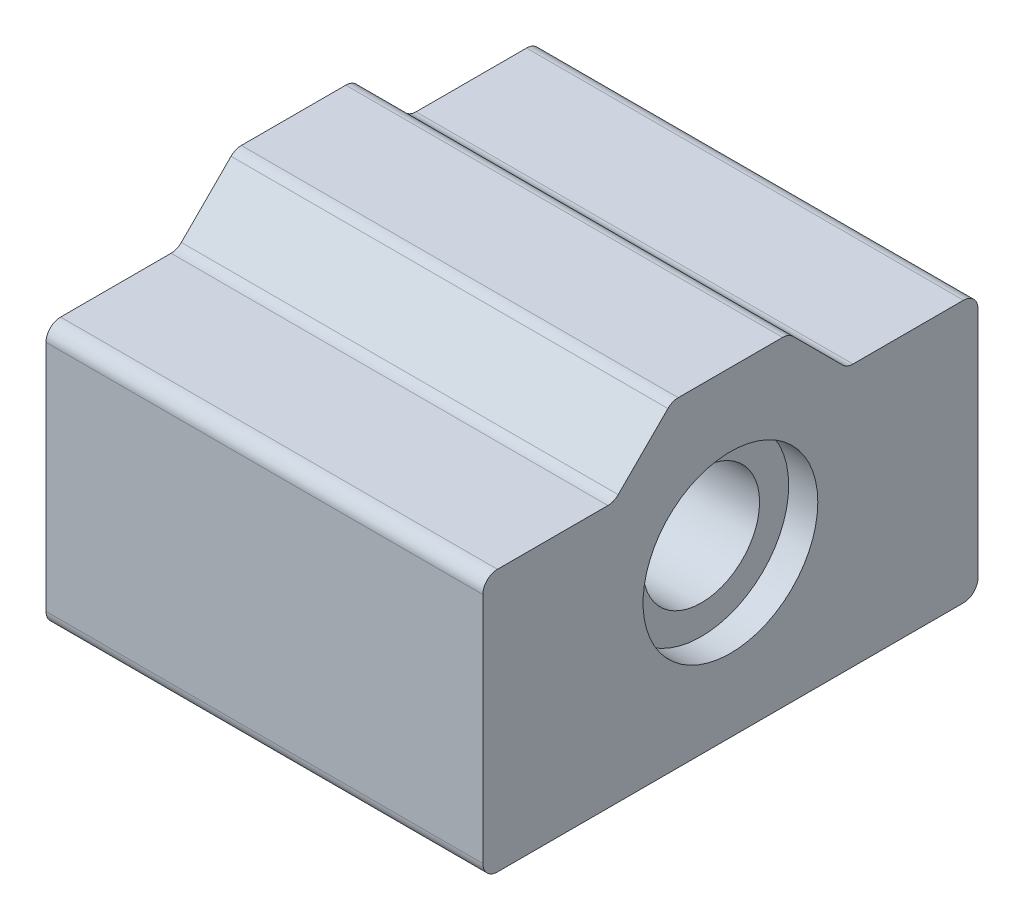
ISO-10303-21;
HEADER;
FILE_DESCRIPTION(('STEP AP214'),'2;1');
FILE_NAME('part.step','',(''),(''),'','','');
FILE_SCHEMA(('AUTOMOTIVE_DESIGN { 1 0 10303 214 1 1 1 1 }'));
ENDSEC;
DATA;
#1=APPLICATION_CONTEXT('core data for automotive mechanical design processes');
#2=APPLICATION_PROTOCOL_DEFINITION('international standard','automotive_design',2000,#1);
#3=PRODUCT_CONTEXT('',#1,'mechanical');
#4=PRODUCT('Part','Part','',(#3));
#5=PRODUCT_RELATED_PRODUCT_CATEGORY('part','',(#4));
#6=PRODUCT_DEFINITION_FORMATION('','',#4);
#7=PRODUCT_DEFINITION_CONTEXT('part definition',#1,'design');
#8=PRODUCT_DEFINITION('design','',#6,#7);
#9=PRODUCT_DEFINITION_SHAPE('','',#8);
#10=(LENGTH_UNIT() NAMED_UNIT(*) SI_UNIT(.MILLI.,.METRE.));
#11=(NAMED_UNIT(*) PLANE_ANGLE_UNIT() SI_UNIT($,.RADIAN.));
#12=(NAMED_UNIT(*) SI_UNIT($,.STERADIAN.) SOLID_ANGLE_UNIT());
#13=UNCERTAINTY_MEASURE_WITH_UNIT(LENGTH_MEASURE(1.E-05),#10,'distance_accuracy_value','');
#14=(GEOMETRIC_REPRESENTATION_CONTEXT(3) GLOBAL_UNCERTAINTY_ASSIGNED_CONTEXT((#13)) GLOBAL_UNIT_ASSIGNED_CONTEXT((#10,
#11,#12)) REPRESENTATION_CONTEXT('',''));
#15=CARTESIAN_POINT('',(0.,0.,0.));
#16=DIRECTION('',(0.,0.,1.));
#17=DIRECTION('',(1.,0.,0.));
#18=AXIS2_PLACEMENT_3D('',#15,#16,#17);
#19=CARTESIAN_POINT('',(30.,-7.,-4.88281199959495));
#20=DIRECTION('',(-1.,0.,0.));
#21=DIRECTION('',(0.,0.,1.));
#22=AXIS2_PLACEMENT_3D('',#19,#20,#21);
#23=CYLINDRICAL_SURFACE('',#22,4.);
#24=CARTESIAN_POINT('',(2.,-7.,-4.88281199959495));
#25=DIRECTION('',(-1.,0.,0.));
#26=DIRECTION('',(0.,0.,1.));
#27=AXIS2_PLACEMENT_3D('',#24,#25,#26);
#28=CIRCLE('',#27,4.);
#29=CARTESIAN_POINT('',(2.,-7.,-0.882811999594952));
#30=VERTEX_POINT('',#29);
#31=EDGE_CURVE('E247',#30,#30,#28,.T.);
#32=ORIENTED_EDGE('',*,*,#31,.T.);
#33=EDGE_LOOP('',(#32));
#34=FACE_BOUND('',#33,.T.);
#35=CARTESIAN_POINT('',(28.,-7.,-4.88281199959495));
#36=DIRECTION('',(1.,0.,0.));
#37=DIRECTION('',(0.,0.,-1.));
#38=AXIS2_PLACEMENT_3D('',#35,#36,#37);
#39=CIRCLE('',#38,4.);
#40=CARTESIAN_POINT('',(28.,-7.,-8.88281199959495));
#41=VERTEX_POINT('',#40);
#42=EDGE_CURVE('E38',#41,#41,#39,.T.);
#43=ORIENTED_EDGE('',*,*,#42,.T.);
#44=EDGE_LOOP('',(#43));
#45=FACE_BOUND('',#44,.T.);
#46=ADVANCED_FACE('F34',(#34,#45),#23,.F.);
#47=CARTESIAN_POINT('',(30.,-17.,11.117188000405));
#48=DIRECTION('',(-1.,0.,0.));
#49=DIRECTION('',(0.,0.,1.));
#50=AXIS2_PLACEMENT_3D('',#47,#48,#49);
#51=PLANE('',#50);
#52=CARTESIAN_POINT('',(30.,-7.,-4.88281199959495));
#53=DIRECTION('',(1.,0.,0.));
#54=DIRECTION('',(0.,0.,-1.));
#55=AXIS2_PLACEMENT_3D('',#52,#53,#54);
#56=CIRCLE('',#55,6.);
#57=CARTESIAN_POINT('',(30.,-7.,-10.882811999595));
#58=VERTEX_POINT('',#57);
#59=EDGE_CURVE('E264',#58,#58,#56,.T.);
#60=ORIENTED_EDGE('',*,*,#59,.F.);
#61=EDGE_LOOP('',(#60));
#62=FACE_BOUND('',#61,.T.);
#63=CARTESIAN_POINT('',(30.,-17.,11.117188000405));
#64=DIRECTION('',(1.,0.,0.));
#65=DIRECTION('',(0.,0.,1.));
#66=AXIS2_PLACEMENT_3D('',#63,#64,#65);
#67=CIRCLE('',#66,1.);
#68=CARTESIAN_POINT('',(30.,-17.,12.117188000405));
#69=VERTEX_POINT('',#68);
#70=CARTESIAN_POINT('',(30.,-18.,11.117188000405));
#71=VERTEX_POINT('',#70);
#72=EDGE_CURVE('E212',#69,#71,#67,.T.);
#73=ORIENTED_EDGE('',*,*,#72,.T.);
#74=DIRECTION('',(0.,0.,-1.));
#75=VECTOR('',#74,1.);
#76=CARTESIAN_POINT('',(30.,-18.,11.117188000405));
#77=LINE('',#76,#75);
#78=CARTESIAN_POINT('',(30.,-18.,-20.8828119995949));
#79=VERTEX_POINT('',#78);
#80=EDGE_CURVE('E120',#71,#79,#77,.T.);
#81=ORIENTED_EDGE('',*,*,#80,.T.);
#82=CARTESIAN_POINT('',(30.,-17.,-20.882811999595));
#83=DIRECTION('',(1.,0.,0.));
#84=DIRECTION('',(0.,0.,1.));
#85=AXIS2_PLACEMENT_3D('',#82,#83,#84);
#86=CIRCLE('',#85,1.);
#87=CARTESIAN_POINT('',(30.,-17.,-21.882811999595));
#88=VERTEX_POINT('',#87);
#89=EDGE_CURVE('E288',#79,#88,#86,.T.);
#90=ORIENTED_EDGE('',*,*,#89,.T.);
#91=DIRECTION('',(0.,1.,0.));
#92=VECTOR('',#91,1.);
#93=CARTESIAN_POINT('',(30.,-17.,-21.882811999595));
#94=LINE('',#93,#92);
#95=CARTESIAN_POINT('',(30.,-1.00000000000001,-21.8828119995949));
#96=VERTEX_POINT('',#95);
#97=EDGE_CURVE('E290',#88,#96,#94,.T.);
#98=ORIENTED_EDGE('',*,*,#97,.T.);
#99=CARTESIAN_POINT('',(30.,-1.,-20.8828119995949));
#100=DIRECTION('',(1.,0.,0.));
#101=DIRECTION('',(0.,0.,-1.));
#102=AXIS2_PLACEMENT_3D('',#99,#100,#101);
#103=CIRCLE('',#102,1.);
#104=CARTESIAN_POINT('',(30.,0.,-20.8828119995949));
#105=VERTEX_POINT('',#104);
#106=EDGE_CURVE('E292',#96,#105,#103,.T.);
#107=ORIENTED_EDGE('',*,*,#106,.T.);
#108=DIRECTION('',(0.,0.,1.));
#109=VECTOR('',#108,1.);
#110=CARTESIAN_POINT('',(30.,0.,-20.8828119995949));
#111=LINE('',#110,#109);
#112=CARTESIAN_POINT('',(30.,0.,-13.2970255619681));
#113=VERTEX_POINT('',#112);
#114=EDGE_CURVE('E294',#105,#113,#111,.T.);
#115=ORIENTED_EDGE('',*,*,#114,.T.);
#116=CARTESIAN_POINT('',(30.,1.,-13.297025561968));
#117=DIRECTION('',(-1.,0.,0.));
#118=DIRECTION('',(0.,0.,1.));
#119=AXIS2_PLACEMENT_3D('',#116,#117,#118);
#120=CIRCLE('',#119,1.);
#121=CARTESIAN_POINT('',(30.,0.292893218813455,-12.5899187807815));
#122=VERTEX_POINT('',#121);
#123=EDGE_CURVE('E296',#113,#122,#120,.T.);
#124=ORIENTED_EDGE('',*,*,#123,.T.);
#125=DIRECTION('',(0.,0.707106781186548,0.707106781186547));
#126=VECTOR('',#125,1.);
#127=CARTESIAN_POINT('',(30.,0.292893218813455,-12.5899187807815));
#128=LINE('',#127,#126);
#129=CARTESIAN_POINT('',(30.,3.70710678118654,-9.17570521840842));
#130=VERTEX_POINT('',#129);
#131=EDGE_CURVE('E298',#122,#130,#128,.T.);
#132=ORIENTED_EDGE('',*,*,#131,.T.);
#133=CARTESIAN_POINT('',(30.,3.,-8.46859843722186));
#134=DIRECTION('',(1.,0.,0.));
#135=DIRECTION('',(0.,0.,-1.));
#136=AXIS2_PLACEMENT_3D('',#133,#134,#135);
#137=CIRCLE('',#136,1.);
#138=CARTESIAN_POINT('',(30.,4.,-8.46859843722186));
#139=VERTEX_POINT('',#138);
#140=EDGE_CURVE('E300',#130,#139,#137,.T.);
#141=ORIENTED_EDGE('',*,*,#140,.T.);
#142=DIRECTION('',(0.,0.,1.));
#143=VECTOR('',#142,1.);
#144=CARTESIAN_POINT('',(30.,4.,-8.46859843722186));
#145=LINE('',#144,#143);
#146=CARTESIAN_POINT('',(30.,4.,-1.29702556196805));
#147=VERTEX_POINT('',#146);
#148=EDGE_CURVE('E302',#139,#147,#145,.T.);
#149=ORIENTED_EDGE('',*,*,#148,.T.);
#150=CARTESIAN_POINT('',(30.,3.,-1.29702556196804));
#151=DIRECTION('',(1.,0.,0.));
#152=DIRECTION('',(0.,0.,-1.));
#153=AXIS2_PLACEMENT_3D('',#150,#151,#152);
#154=CIRCLE('',#153,1.);
#155=CARTESIAN_POINT('',(30.,3.70710678118654,-0.589918780781494));
#156=VERTEX_POINT('',#155);
#157=EDGE_CURVE('E304',#147,#156,#154,.T.);
#158=ORIENTED_EDGE('',*,*,#157,.T.);
#159=DIRECTION('',(0.,-0.707106781186547,0.707106781186548));
#160=VECTOR('',#159,1.);
#161=CARTESIAN_POINT('',(30.,3.70710678118654,-0.589918780781494));
#162=LINE('',#161,#160);
#163=CARTESIAN_POINT('',(30.,0.292893218813453,2.8242947815916));
#164=VERTEX_POINT('',#163);
#165=EDGE_CURVE('E306',#156,#164,#162,.T.);
#166=ORIENTED_EDGE('',*,*,#165,.T.);
#167=CARTESIAN_POINT('',(30.,0.999999999999998,3.53140156277815));
#168=DIRECTION('',(-1.,0.,0.));
#169=DIRECTION('',(0.,0.,1.));
#170=AXIS2_PLACEMENT_3D('',#167,#168,#169);
#171=CIRCLE('',#170,1.);
#172=CARTESIAN_POINT('',(30.,0.,3.53140156277815));
#173=VERTEX_POINT('',#172);
#174=EDGE_CURVE('E163',#164,#173,#171,.T.);
#175=ORIENTED_EDGE('',*,*,#174,.T.);
#176=DIRECTION('',(0.,0.,1.));
#177=VECTOR('',#176,1.);
#178=CARTESIAN_POINT('',(30.,0.,3.53140156277815));
#179=LINE('',#178,#177);
#180=CARTESIAN_POINT('',(30.,0.,11.117188000405));
#181=VERTEX_POINT('',#180);
#182=EDGE_CURVE('E157',#173,#181,#179,.T.);
#183=ORIENTED_EDGE('',*,*,#182,.T.);
#184=CARTESIAN_POINT('',(30.,-1.,11.117188000405));
#185=DIRECTION('',(1.,0.,0.));
#186=DIRECTION('',(0.,0.,1.));
#187=AXIS2_PLACEMENT_3D('',#184,#185,#186);
#188=CIRCLE('',#187,1.);
#189=CARTESIAN_POINT('',(30.,-1.00000000000001,12.1171880004051));
#190=VERTEX_POINT('',#189);
#191=EDGE_CURVE('E161',#181,#190,#188,.T.);
#192=ORIENTED_EDGE('',*,*,#191,.T.);
#193=DIRECTION('',(0.,-1.,0.));
#194=VECTOR('',#193,1.);
#195=CARTESIAN_POINT('',(30.,-1.00000000000001,12.1171880004051));
#196=LINE('',#195,#194);
#197=EDGE_CURVE('E53',#190,#69,#196,.T.);
#198=ORIENTED_EDGE('',*,*,#197,.T.);
#199=EDGE_LOOP('',(#73,#81,#90,#98,#107,#115,#124,#132,#141,#149,#158,#166,#175,#183,#192,#198));
#200=FACE_BOUND('',#199,.T.);
#201=ADVANCED_FACE('F159',(#62,#200),#51,.F.);
#202=CARTESIAN_POINT('',(0.,-17.,11.117188000405));
#203=DIRECTION('',(-1.,0.,0.));
#204=DIRECTION('',(0.,0.,1.));
#205=AXIS2_PLACEMENT_3D('',#202,#203,#204);
#206=PLANE('',#205);
#207=CARTESIAN_POINT('',(0.,-7.,-4.88281199959495));
#208=DIRECTION('',(-1.,0.,0.));
#209=DIRECTION('',(0.,0.,1.));
#210=AXIS2_PLACEMENT_3D('',#207,#208,#209);
#211=CIRCLE('',#210,6.);
#212=CARTESIAN_POINT('',(0.,-7.,1.11718800040505));
#213=VERTEX_POINT('',#212);
#214=EDGE_CURVE('E257',#213,#213,#211,.T.);
#215=ORIENTED_EDGE('',*,*,#214,.F.);
#216=EDGE_LOOP('',(#215));
#217=FACE_BOUND('',#216,.T.);
#218=CARTESIAN_POINT('',(0.,-17.,11.117188000405));
#219=DIRECTION('',(1.,0.,0.));
#220=DIRECTION('',(0.,0.,1.));
#221=AXIS2_PLACEMENT_3D('',#218,#219,#220);
#222=CIRCLE('',#221,1.);
#223=CARTESIAN_POINT('',(0.,-17.,12.117188000405));
#224=VERTEX_POINT('',#223);
#225=CARTESIAN_POINT('',(0.,-18.,11.117188000405));
#226=VERTEX_POINT('',#225);
#227=EDGE_CURVE('E181',#224,#226,#222,.T.);
#228=ORIENTED_EDGE('',*,*,#227,.F.);
#229=DIRECTION('',(0.,-1.,0.));
#230=VECTOR('',#229,1.);
#231=CARTESIAN_POINT('',(0.,-1.00000000000001,12.1171880004051));
#232=LINE('',#231,#230);
#233=CARTESIAN_POINT('',(0.,-1.00000000000001,12.1171880004051));
#234=VERTEX_POINT('',#233);
#235=EDGE_CURVE('E112',#234,#224,#232,.T.);
#236=ORIENTED_EDGE('',*,*,#235,.F.);
#237=CARTESIAN_POINT('',(0.,-1.,11.117188000405));
#238=DIRECTION('',(1.,0.,0.));
#239=DIRECTION('',(0.,0.,1.));
#240=AXIS2_PLACEMENT_3D('',#237,#238,#239);
#241=CIRCLE('',#240,1.);
#242=CARTESIAN_POINT('',(0.,0.,11.117188000405));
#243=VERTEX_POINT('',#242);
#244=EDGE_CURVE('E106',#243,#234,#241,.T.);
#245=ORIENTED_EDGE('',*,*,#244,.F.);
#246=DIRECTION('',(0.,0.,1.));
#247=VECTOR('',#246,1.);
#248=CARTESIAN_POINT('',(0.,0.,3.53140156277815));
#249=LINE('',#248,#247);
#250=CARTESIAN_POINT('',(0.,0.,3.53140156277815));
#251=VERTEX_POINT('',#250);
#252=EDGE_CURVE('E171',#251,#243,#249,.T.);
#253=ORIENTED_EDGE('',*,*,#252,.F.);
#254=CARTESIAN_POINT('',(0.,0.999999999999998,3.53140156277815));
#255=DIRECTION('',(-1.,0.,0.));
#256=DIRECTION('',(0.,0.,1.));
#257=AXIS2_PLACEMENT_3D('',#254,#255,#256);
#258=CIRCLE('',#257,1.);
#259=CARTESIAN_POINT('',(0.,0.292893218813453,2.8242947815916));
#260=VERTEX_POINT('',#259);
#261=EDGE_CURVE('E207',#260,#251,#258,.T.);
#262=ORIENTED_EDGE('',*,*,#261,.F.);
#263=DIRECTION('',(0.,-0.707106781186547,0.707106781186548));
#264=VECTOR('',#263,1.);
#265=CARTESIAN_POINT('',(0.,3.70710678118654,-0.589918780781494));
#266=LINE('',#265,#264);
#267=CARTESIAN_POINT('',(0.,3.70710678118654,-0.589918780781494));
#268=VERTEX_POINT('',#267);
#269=EDGE_CURVE('E205',#268,#260,#266,.T.);
#270=ORIENTED_EDGE('',*,*,#269,.F.);
#271=CARTESIAN_POINT('',(0.,3.,-1.29702556196804));
#272=DIRECTION('',(1.,0.,0.));
#273=DIRECTION('',(0.,0.,-1.));
#274=AXIS2_PLACEMENT_3D('',#271,#272,#273);
#275=CIRCLE('',#274,1.);
#276=CARTESIAN_POINT('',(0.,4.,-1.29702556196805));
#277=VERTEX_POINT('',#276);
#278=EDGE_CURVE('E203',#277,#268,#275,.T.);
#279=ORIENTED_EDGE('',*,*,#278,.F.);
#280=DIRECTION('',(0.,0.,1.));
#281=VECTOR('',#280,1.);
#282=CARTESIAN_POINT('',(0.,4.,-8.46859843722186));
#283=LINE('',#282,#281);
#284=CARTESIAN_POINT('',(0.,4.,-8.46859843722186));
#285=VERTEX_POINT('',#284);
#286=EDGE_CURVE('E201',#285,#277,#283,.T.);
#287=ORIENTED_EDGE('',*,*,#286,.F.);
#288=CARTESIAN_POINT('',(0.,3.,-8.46859843722186));
#289=DIRECTION('',(1.,0.,0.));
#290=DIRECTION('',(0.,0.,-1.));
#291=AXIS2_PLACEMENT_3D('',#288,#289,#290);
#292=CIRCLE('',#291,1.);
#293=CARTESIAN_POINT('',(0.,3.70710678118654,-9.17570521840842));
#294=VERTEX_POINT('',#293);
#295=EDGE_CURVE('E199',#294,#285,#292,.T.);
#296=ORIENTED_EDGE('',*,*,#295,.F.);
#297=DIRECTION('',(0.,0.707106781186548,0.707106781186547));
#298=VECTOR('',#297,1.);
#299=CARTESIAN_POINT('',(0.,0.292893218813455,-12.5899187807815));
#300=LINE('',#299,#298);
#301=CARTESIAN_POINT('',(0.,0.292893218813455,-12.5899187807815));
#302=VERTEX_POINT('',#301);
#303=EDGE_CURVE('E197',#302,#294,#300,.T.);
#304=ORIENTED_EDGE('',*,*,#303,.F.);
#305=CARTESIAN_POINT('',(0.,1.,-13.297025561968));
#306=DIRECTION('',(-1.,0.,0.));
#307=DIRECTION('',(0.,0.,1.));
#308=AXIS2_PLACEMENT_3D('',#305,#306,#307);
#309=CIRCLE('',#308,1.);
#310=CARTESIAN_POINT('',(0.,0.,-13.2970255619681));
#311=VERTEX_POINT('',#310);
#312=EDGE_CURVE('E195',#311,#302,#309,.T.);
#313=ORIENTED_EDGE('',*,*,#312,.F.);
#314=DIRECTION('',(0.,0.,1.));
#315=VECTOR('',#314,1.);
#316=CARTESIAN_POINT('',(0.,0.,-20.8828119995949));
#317=LINE('',#316,#315);
#318=CARTESIAN_POINT('',(0.,0.,-20.8828119995949));
#319=VERTEX_POINT('',#318);
#320=EDGE_CURVE('E193',#319,#311,#317,.T.);
#321=ORIENTED_EDGE('',*,*,#320,.F.);
#322=CARTESIAN_POINT('',(0.,-1.,-20.8828119995949));
#323=DIRECTION('',(1.,0.,0.));
#324=DIRECTION('',(0.,0.,-1.));
#325=AXIS2_PLACEMENT_3D('',#322,#323,#324);
#326=CIRCLE('',#325,1.);
#327=CARTESIAN_POINT('',(0.,-1.00000000000001,-21.8828119995949));
#328=VERTEX_POINT('',#327);
#329=EDGE_CURVE('E191',#328,#319,#326,.T.);
#330=ORIENTED_EDGE('',*,*,#329,.F.);
#331=DIRECTION('',(0.,1.,0.));
#332=VECTOR('',#331,1.);
#333=CARTESIAN_POINT('',(0.,-17.,-21.882811999595));
#334=LINE('',#333,#332);
#335=CARTESIAN_POINT('',(0.,-17.,-21.882811999595));
#336=VERTEX_POINT('',#335);
#337=EDGE_CURVE('E189',#336,#328,#334,.T.);
#338=ORIENTED_EDGE('',*,*,#337,.F.);
#339=CARTESIAN_POINT('',(0.,-17.,-20.882811999595));
#340=DIRECTION('',(1.,0.,0.));
#341=DIRECTION('',(0.,0.,1.));
#342=AXIS2_PLACEMENT_3D('',#339,#340,#341);
#343=CIRCLE('',#342,1.);
#344=CARTESIAN_POINT('',(0.,-18.,-20.8828119995949));
#345=VERTEX_POINT('',#344);
#346=EDGE_CURVE('E187',#345,#336,#343,.T.);
#347=ORIENTED_EDGE('',*,*,#346,.F.);
#348=DIRECTION('',(0.,0.,-1.));
#349=VECTOR('',#348,1.);
#350=CARTESIAN_POINT('',(0.,-18.,11.117188000405));
#351=LINE('',#350,#349);
#352=EDGE_CURVE('E184',#226,#345,#351,.T.);
#353=ORIENTED_EDGE('',*,*,#352,.F.);
#354=EDGE_LOOP('',(#228,#236,#245,#253,#262,#270,#279,#287,#296,#304,#313,#321,#330,#338,#347,#353));
#355=FACE_BOUND('',#354,.T.);
#356=ADVANCED_FACE('F319',(#217,#355),#206,.T.);
#357=CARTESIAN_POINT('',(30.,-17.,11.117188000405));
#358=DIRECTION('',(-1.,0.,0.));
#359=DIRECTION('',(0.,0.,1.));
#360=AXIS2_PLACEMENT_3D('',#357,#358,#359);
#361=CYLINDRICAL_SURFACE('',#360,1.);
#362=ORIENTED_EDGE('',*,*,#227,.T.);
#363=DIRECTION('',(-1.,0.,0.));
#364=VECTOR('',#363,1.);
#365=CARTESIAN_POINT('',(30.,-18.,11.117188000405));
#366=LINE('',#365,#364);
#367=EDGE_CURVE('E11',#71,#226,#366,.T.);
#368=ORIENTED_EDGE('',*,*,#367,.F.);
#369=ORIENTED_EDGE('',*,*,#72,.F.);
#370=DIRECTION('',(-1.,0.,0.));
#371=VECTOR('',#370,1.);
#372=CARTESIAN_POINT('',(30.,-17.,12.117188000405));
#373=LINE('',#372,#371);
#374=EDGE_CURVE('E177',#69,#224,#373,.T.);
#375=ORIENTED_EDGE('',*,*,#374,.T.);
#376=EDGE_LOOP('',(#362,#368,#369,#375));
#377=FACE_BOUND('',#376,.T.);
#378=ADVANCED_FACE('F36',(#377),#361,.T.);
#379=CARTESIAN_POINT('',(30.,-18.,11.117188000405));
#380=DIRECTION('',(0.,1.,0.));
#381=DIRECTION('',(0.,0.,1.));
#382=AXIS2_PLACEMENT_3D('',#379,#380,#381);
#383=PLANE('',#382);
#384=CARTESIAN_POINT('',(6.,-18.,-16.8828119995949));
#385=DIRECTION('',(0.,-1.,0.));
#386=DIRECTION('',(0.,0.,-1.));
#387=AXIS2_PLACEMENT_3D('',#384,#385,#386);
#388=CIRCLE('',#387,2.);
#389=CARTESIAN_POINT('',(6.,-18.,-18.882811999595));
#390=VERTEX_POINT('',#389);
#391=EDGE_CURVE('E271',#390,#390,#388,.T.);
#392=ORIENTED_EDGE('',*,*,#391,.F.);
#393=EDGE_LOOP('',(#392));
#394=FACE_BOUND('',#393,.T.);
#395=CARTESIAN_POINT('',(6.,-18.,7.11718800040505));
#396=DIRECTION('',(0.,-1.,0.));
#397=DIRECTION('',(0.,0.,-1.));
#398=AXIS2_PLACEMENT_3D('',#395,#396,#397);
#399=CIRCLE('',#398,2.);
#400=CARTESIAN_POINT('',(6.,-18.,5.11718800040505));
#401=VERTEX_POINT('',#400);
#402=EDGE_CURVE('E277',#401,#401,#399,.T.);
#403=ORIENTED_EDGE('',*,*,#402,.F.);
#404=EDGE_LOOP('',(#403));
#405=FACE_BOUND('',#404,.T.);
#406=CARTESIAN_POINT('',(24.,-18.,7.11718800040504));
#407=DIRECTION('',(0.,-1.,0.));
#408=DIRECTION('',(0.,0.,-1.));
#409=AXIS2_PLACEMENT_3D('',#406,#407,#408);
#410=CIRCLE('',#409,2.);
#411=CARTESIAN_POINT('',(24.,-18.,5.11718800040504));
#412=VERTEX_POINT('',#411);
#413=EDGE_CURVE('E249',#412,#412,#410,.T.);
#414=ORIENTED_EDGE('',*,*,#413,.F.);
#415=EDGE_LOOP('',(#414));
#416=FACE_BOUND('',#415,.T.);
#417=CARTESIAN_POINT('',(24.,-18.,-16.882811999595));
#418=DIRECTION('',(0.,-1.,0.));
#419=DIRECTION('',(0.,0.,-1.));
#420=AXIS2_PLACEMENT_3D('',#417,#418,#419);
#421=CIRCLE('',#420,2.);
#422=CARTESIAN_POINT('',(24.,-18.,-18.882811999595));
#423=VERTEX_POINT('',#422);
#424=EDGE_CURVE('E270',#423,#423,#421,.T.);
#425=ORIENTED_EDGE('',*,*,#424,.F.);
#426=EDGE_LOOP('',(#425));
#427=FACE_BOUND('',#426,.T.);
#428=ORIENTED_EDGE('',*,*,#352,.T.);
#429=DIRECTION('',(-1.,0.,0.));
#430=VECTOR('',#429,1.);
#431=CARTESIAN_POINT('',(30.,-18.,-20.8828119995949));
#432=LINE('',#431,#430);
#433=EDGE_CURVE('E44',#79,#345,#432,.T.);
#434=ORIENTED_EDGE('',*,*,#433,.F.);
#435=ORIENTED_EDGE('',*,*,#80,.F.);
#436=ORIENTED_EDGE('',*,*,#367,.T.);
#437=EDGE_LOOP('',(#428,#434,#435,#436));
#438=FACE_BOUND('',#437,.T.);
#439=ADVANCED_FACE('F351',(#394,#405,#416,#427,#438),#383,.F.);
#440=CARTESIAN_POINT('',(30.,-17.,-20.882811999595));
#441=DIRECTION('',(-1.,0.,0.));
#442=DIRECTION('',(0.,0.,1.));
#443=AXIS2_PLACEMENT_3D('',#440,#441,#442);
#444=CYLINDRICAL_SURFACE('',#443,1.);
#445=ORIENTED_EDGE('',*,*,#346,.T.);
#446=DIRECTION('',(-1.,0.,0.));
#447=VECTOR('',#446,1.);
#448=CARTESIAN_POINT('',(30.,-17.,-21.882811999595));
#449=LINE('',#448,#447);
#450=EDGE_CURVE('E243',#88,#336,#449,.T.);
#451=ORIENTED_EDGE('',*,*,#450,.F.);
#452=ORIENTED_EDGE('',*,*,#89,.F.);
#453=ORIENTED_EDGE('',*,*,#433,.T.);
#454=EDGE_LOOP('',(#445,#451,#452,#453));
#455=FACE_BOUND('',#454,.T.);
#456=ADVANCED_FACE('F399',(#455),#444,.T.);
#457=CARTESIAN_POINT('',(30.,-17.,-21.882811999595));
#458=DIRECTION('',(0.,0.,1.));
#459=DIRECTION('',(0.,-1.,0.));
#460=AXIS2_PLACEMENT_3D('',#457,#458,#459);
#461=PLANE('',#460);
#462=ORIENTED_EDGE('',*,*,#337,.T.);
#463=DIRECTION('',(-1.,0.,0.));
#464=VECTOR('',#463,1.);
#465=CARTESIAN_POINT('',(30.,-1.00000000000001,-21.8828119995949));
#466=LINE('',#465,#464);
#467=EDGE_CURVE('E240',#96,#328,#466,.T.);
#468=ORIENTED_EDGE('',*,*,#467,.F.);
#469=ORIENTED_EDGE('',*,*,#97,.F.);
#470=ORIENTED_EDGE('',*,*,#450,.T.);
#471=EDGE_LOOP('',(#462,#468,#469,#470));
#472=FACE_BOUND('',#471,.T.);
#473=ADVANCED_FACE('F409',(#472),#461,.F.);
#474=CARTESIAN_POINT('',(30.,-1.,-20.8828119995949));
#475=DIRECTION('',(-1.,0.,0.));
#476=DIRECTION('',(0.,0.,1.));
#477=AXIS2_PLACEMENT_3D('',#474,#475,#476);
#478=CYLINDRICAL_SURFACE('',#477,1.);
#479=ORIENTED_EDGE('',*,*,#329,.T.);
#480=DIRECTION('',(-1.,0.,0.));
#481=VECTOR('',#480,1.);
#482=CARTESIAN_POINT('',(30.,0.,-20.8828119995949));
#483=LINE('',#482,#481);
#484=EDGE_CURVE('E237',#105,#319,#483,.T.);
#485=ORIENTED_EDGE('',*,*,#484,.F.);
#486=ORIENTED_EDGE('',*,*,#106,.F.);
#487=ORIENTED_EDGE('',*,*,#467,.T.);
#488=EDGE_LOOP('',(#479,#485,#486,#487));
#489=FACE_BOUND('',#488,.T.);
#490=ADVANCED_FACE('F413',(#489),#478,.T.);
#491=CARTESIAN_POINT('',(30.,0.,-20.8828119995949));
#492=DIRECTION('',(0.,-1.,0.));
#493=DIRECTION('',(0.,0.,-1.));
#494=AXIS2_PLACEMENT_3D('',#491,#492,#493);
#495=PLANE('',#494);
#496=ORIENTED_EDGE('',*,*,#320,.T.);
#497=DIRECTION('',(-1.,0.,0.));
#498=VECTOR('',#497,1.);
#499=CARTESIAN_POINT('',(30.,0.,-13.2970255619681));
#500=LINE('',#499,#498);
#501=EDGE_CURVE('E234',#113,#311,#500,.T.);
#502=ORIENTED_EDGE('',*,*,#501,.F.);
#503=ORIENTED_EDGE('',*,*,#114,.F.);
#504=ORIENTED_EDGE('',*,*,#484,.T.);
#505=EDGE_LOOP('',(#496,#502,#503,#504));
#506=FACE_BOUND('',#505,.T.);
#507=ADVANCED_FACE('F420',(#506),#495,.F.);
#508=CARTESIAN_POINT('',(30.,1.,-13.297025561968));
#509=DIRECTION('',(-1.,0.,0.));
#510=DIRECTION('',(0.,0.,1.));
#511=AXIS2_PLACEMENT_3D('',#508,#509,#510);
#512=CYLINDRICAL_SURFACE('',#511,1.);
#513=ORIENTED_EDGE('',*,*,#312,.T.);
#514=DIRECTION('',(-1.,0.,0.));
#515=VECTOR('',#514,1.);
#516=CARTESIAN_POINT('',(30.,0.292893218813455,-12.5899187807815));
#517=LINE('',#516,#515);
#518=EDGE_CURVE('E231',#122,#302,#517,.T.);
#519=ORIENTED_EDGE('',*,*,#518,.F.);
#520=ORIENTED_EDGE('',*,*,#123,.F.);
#521=ORIENTED_EDGE('',*,*,#501,.T.);
#522=EDGE_LOOP('',(#513,#519,#520,#521));
#523=FACE_BOUND('',#522,.T.);
#524=ADVANCED_FACE('F423',(#523),#512,.F.);
#525=CARTESIAN_POINT('',(30.,0.292893218813455,-12.5899187807815));
#526=DIRECTION('',(0.,-0.707106781186547,0.707106781186548));
#527=DIRECTION('',(0.,-0.707106781186548,-0.707106781186547));
#528=AXIS2_PLACEMENT_3D('',#525,#526,#527);
#529=PLANE('',#528);
#530=ORIENTED_EDGE('',*,*,#303,.T.);
#531=DIRECTION('',(-1.,0.,0.));
#532=VECTOR('',#531,1.);
#533=CARTESIAN_POINT('',(30.,3.70710678118654,-9.17570521840842));
#534=LINE('',#533,#532);
#535=EDGE_CURVE('E228',#130,#294,#534,.T.);
#536=ORIENTED_EDGE('',*,*,#535,.F.);
#537=ORIENTED_EDGE('',*,*,#131,.F.);
#538=ORIENTED_EDGE('',*,*,#518,.T.);
#539=EDGE_LOOP('',(#530,#536,#537,#538));
#540=FACE_BOUND('',#539,.T.);
#541=ADVANCED_FACE('F428',(#540),#529,.F.);
#542=CARTESIAN_POINT('',(30.,3.,-8.46859843722186));
#543=DIRECTION('',(-1.,0.,0.));
#544=DIRECTION('',(0.,0.,1.));
#545=AXIS2_PLACEMENT_3D('',#542,#543,#544);
#546=CYLINDRICAL_SURFACE('',#545,1.);
#547=ORIENTED_EDGE('',*,*,#295,.T.);
#548=DIRECTION('',(-1.,0.,0.));
#549=VECTOR('',#548,1.);
#550=CARTESIAN_POINT('',(30.,4.,-8.46859843722186));
#551=LINE('',#550,#549);
#552=EDGE_CURVE('E225',#139,#285,#551,.T.);
#553=ORIENTED_EDGE('',*,*,#552,.F.);
#554=ORIENTED_EDGE('',*,*,#140,.F.);
#555=ORIENTED_EDGE('',*,*,#535,.T.);
#556=EDGE_LOOP('',(#547,#553,#554,#555));
#557=FACE_BOUND('',#556,.T.);
#558=ADVANCED_FACE('F434',(#557),#546,.T.);
#559=CARTESIAN_POINT('',(30.,4.,-8.46859843722186));
#560=DIRECTION('',(0.,-1.,0.));
#561=DIRECTION('',(0.,0.,-1.));
#562=AXIS2_PLACEMENT_3D('',#559,#560,#561);
#563=PLANE('',#562);
#564=ORIENTED_EDGE('',*,*,#286,.T.);
#565=DIRECTION('',(-1.,0.,0.));
#566=VECTOR('',#565,1.);
#567=CARTESIAN_POINT('',(30.,4.,-1.29702556196805));
#568=LINE('',#567,#566);
#569=EDGE_CURVE('E222',#147,#277,#568,.T.);
#570=ORIENTED_EDGE('',*,*,#569,.F.);
#571=ORIENTED_EDGE('',*,*,#148,.F.);
#572=ORIENTED_EDGE('',*,*,#552,.T.);
#573=EDGE_LOOP('',(#564,#570,#571,#572));
#574=FACE_BOUND('',#573,.T.);
#575=ADVANCED_FACE('F438',(#574),#563,.F.);
#576=CARTESIAN_POINT('',(30.,3.,-1.29702556196804));
#577=DIRECTION('',(-1.,0.,0.));
#578=DIRECTION('',(0.,0.,1.));
#579=AXIS2_PLACEMENT_3D('',#576,#577,#578);
#580=CYLINDRICAL_SURFACE('',#579,1.);
#581=ORIENTED_EDGE('',*,*,#278,.T.);
#582=DIRECTION('',(-1.,0.,0.));
#583=VECTOR('',#582,1.);
#584=CARTESIAN_POINT('',(30.,3.70710678118654,-0.589918780781494));
#585=LINE('',#584,#583);
#586=EDGE_CURVE('E219',#156,#268,#585,.T.);
#587=ORIENTED_EDGE('',*,*,#586,.F.);
#588=ORIENTED_EDGE('',*,*,#157,.F.);
#589=ORIENTED_EDGE('',*,*,#569,.T.);
#590=EDGE_LOOP('',(#581,#587,#588,#589));
#591=FACE_BOUND('',#590,.T.);
#592=ADVANCED_FACE('F441',(#591),#580,.T.);
#593=CARTESIAN_POINT('',(30.,3.70710678118654,-0.589918780781494));
#594=DIRECTION('',(0.,-0.707106781186548,-0.707106781186547));
#595=DIRECTION('',(0.,0.707106781186547,-0.707106781186548));
#596=AXIS2_PLACEMENT_3D('',#593,#594,#595);
#597=PLANE('',#596);
#598=ORIENTED_EDGE('',*,*,#269,.T.);
#599=DIRECTION('',(-1.,0.,0.));
#600=VECTOR('',#599,1.);
#601=CARTESIAN_POINT('',(30.,0.292893218813453,2.8242947815916));
#602=LINE('',#601,#600);
#603=EDGE_CURVE('E216',#164,#260,#602,.T.);
#604=ORIENTED_EDGE('',*,*,#603,.F.);
#605=ORIENTED_EDGE('',*,*,#165,.F.);
#606=ORIENTED_EDGE('',*,*,#586,.T.);
#607=EDGE_LOOP('',(#598,#604,#605,#606));
#608=FACE_BOUND('',#607,.T.);
#609=ADVANCED_FACE('F312',(#608),#597,.F.);
#610=CARTESIAN_POINT('',(30.,0.999999999999998,3.53140156277815));
#611=DIRECTION('',(-1.,0.,0.));
#612=DIRECTION('',(0.,0.,1.));
#613=AXIS2_PLACEMENT_3D('',#610,#611,#612);
#614=CYLINDRICAL_SURFACE('',#613,1.);
#615=ORIENTED_EDGE('',*,*,#261,.T.);
#616=DIRECTION('',(-1.,0.,0.));
#617=VECTOR('',#616,1.);
#618=CARTESIAN_POINT('',(30.,0.,3.53140156277815));
#619=LINE('',#618,#617);
#620=EDGE_CURVE('E172',#173,#251,#619,.T.);
#621=ORIENTED_EDGE('',*,*,#620,.F.);
#622=ORIENTED_EDGE('',*,*,#174,.F.);
#623=ORIENTED_EDGE('',*,*,#603,.T.);
#624=EDGE_LOOP('',(#615,#621,#622,#623));
#625=FACE_BOUND('',#624,.T.);
#626=ADVANCED_FACE('F316',(#625),#614,.F.);
#627=CARTESIAN_POINT('',(30.,0.,3.53140156277815));
#628=DIRECTION('',(0.,-1.,0.));
#629=DIRECTION('',(0.,0.,-1.));
#630=AXIS2_PLACEMENT_3D('',#627,#628,#629);
#631=PLANE('',#630);
#632=ORIENTED_EDGE('',*,*,#252,.T.);
#633=DIRECTION('',(-1.,0.,0.));
#634=VECTOR('',#633,1.);
#635=CARTESIAN_POINT('',(30.,0.,11.117188000405));
#636=LINE('',#635,#634);
#637=EDGE_CURVE('E168',#181,#243,#636,.T.);
#638=ORIENTED_EDGE('',*,*,#637,.F.);
#639=ORIENTED_EDGE('',*,*,#182,.F.);
#640=ORIENTED_EDGE('',*,*,#620,.T.);
#641=EDGE_LOOP('',(#632,#638,#639,#640));
#642=FACE_BOUND('',#641,.T.);
#643=ADVANCED_FACE('F169',(#642),#631,.F.);
#644=CARTESIAN_POINT('',(30.,-1.,11.117188000405));
#645=DIRECTION('',(-1.,0.,0.));
#646=DIRECTION('',(0.,0.,1.));
#647=AXIS2_PLACEMENT_3D('',#644,#645,#646);
#648=CYLINDRICAL_SURFACE('',#647,1.);
#649=ORIENTED_EDGE('',*,*,#244,.T.);
#650=DIRECTION('',(-1.,0.,0.));
#651=VECTOR('',#650,1.);
#652=CARTESIAN_POINT('',(30.,-1.00000000000001,12.1171880004051));
#653=LINE('',#652,#651);
#654=EDGE_CURVE('E173',#190,#234,#653,.T.);
#655=ORIENTED_EDGE('',*,*,#654,.F.);
#656=ORIENTED_EDGE('',*,*,#191,.F.);
#657=ORIENTED_EDGE('',*,*,#637,.T.);
#658=EDGE_LOOP('',(#649,#655,#656,#657));
#659=FACE_BOUND('',#658,.T.);
#660=ADVANCED_FACE('F175',(#659),#648,.T.);
#661=CARTESIAN_POINT('',(30.,-1.00000000000001,12.1171880004051));
#662=DIRECTION('',(0.,0.,-1.));
#663=DIRECTION('',(0.,1.,0.));
#664=AXIS2_PLACEMENT_3D('',#661,#662,#663);
#665=PLANE('',#664);
#666=ORIENTED_EDGE('',*,*,#235,.T.);
#667=ORIENTED_EDGE('',*,*,#374,.F.);
#668=ORIENTED_EDGE('',*,*,#197,.F.);
#669=ORIENTED_EDGE('',*,*,#654,.T.);
#670=EDGE_LOOP('',(#666,#667,#668,#669));
#671=FACE_BOUND('',#670,.T.);
#672=ADVANCED_FACE('F324',(#671),#665,.F.);
#673=CARTESIAN_POINT('',(24.,-10.,-16.882811999595));
#674=DIRECTION('',(0.,-1.,0.));
#675=DIRECTION('',(0.,0.,-1.));
#676=AXIS2_PLACEMENT_3D('',#673,#674,#675);
#677=CYLINDRICAL_SURFACE('',#676,2.);
#678=CARTESIAN_POINT('',(24.,-10.,-16.882811999595));
#679=DIRECTION('',(0.,-1.,0.));
#680=DIRECTION('',(0.,0.,-1.));
#681=AXIS2_PLACEMENT_3D('',#678,#679,#680);
#682=CIRCLE('',#681,2.);
#683=CARTESIAN_POINT('',(24.,-10.,-18.882811999595));
#684=VERTEX_POINT('',#683);
#685=EDGE_CURVE('E185',#684,#684,#682,.T.);
#686=ORIENTED_EDGE('',*,*,#685,.F.);
#687=EDGE_LOOP('',(#686));
#688=FACE_BOUND('',#687,.T.);
#689=ORIENTED_EDGE('',*,*,#424,.T.);
#690=EDGE_LOOP('',(#689));
#691=FACE_BOUND('',#690,.T.);
#692=ADVANCED_FACE('F326',(#688,#691),#677,.F.);
#693=CARTESIAN_POINT('',(24.,-10.,-16.882811999595));
#694=DIRECTION('',(0.,-1.,0.));
#695=DIRECTION('',(0.,0.,-1.));
#696=AXIS2_PLACEMENT_3D('',#693,#694,#695);
#697=PLANE('',#696);
#698=ORIENTED_EDGE('',*,*,#685,.T.);
#699=EDGE_LOOP('',(#698));
#700=FACE_BOUND('',#699,.T.);
#701=ADVANCED_FACE('F332',(#700),#697,.T.);
#702=CARTESIAN_POINT('',(24.,-10.,7.11718800040504));
#703=DIRECTION('',(0.,-1.,0.));
#704=DIRECTION('',(0.,0.,-1.));
#705=AXIS2_PLACEMENT_3D('',#702,#703,#704);
#706=CYLINDRICAL_SURFACE('',#705,2.);
#707=CARTESIAN_POINT('',(24.,-10.,7.11718800040504));
#708=DIRECTION('',(0.,-1.,0.));
#709=DIRECTION('',(0.,0.,-1.));
#710=AXIS2_PLACEMENT_3D('',#707,#708,#709);
#711=CIRCLE('',#710,2.);
#712=CARTESIAN_POINT('',(24.,-10.,5.11718800040505));
#713=VERTEX_POINT('',#712);
#714=EDGE_CURVE('E254',#713,#713,#711,.T.);
#715=ORIENTED_EDGE('',*,*,#714,.F.);
#716=EDGE_LOOP('',(#715));
#717=FACE_BOUND('',#716,.T.);
#718=ORIENTED_EDGE('',*,*,#413,.T.);
#719=EDGE_LOOP('',(#718));
#720=FACE_BOUND('',#719,.T.);
#721=ADVANCED_FACE('F386',(#717,#720),#706,.F.);
#722=CARTESIAN_POINT('',(24.,-10.,7.11718800040504));
#723=DIRECTION('',(0.,-1.,0.));
#724=DIRECTION('',(0.,0.,-1.));
#725=AXIS2_PLACEMENT_3D('',#722,#723,#724);
#726=PLANE('',#725);
#727=ORIENTED_EDGE('',*,*,#714,.T.);
#728=EDGE_LOOP('',(#727));
#729=FACE_BOUND('',#728,.T.);
#730=ADVANCED_FACE('F382',(#729),#726,.T.);
#731=CARTESIAN_POINT('',(6.,-10.,7.11718800040505));
#732=DIRECTION('',(0.,-1.,0.));
#733=DIRECTION('',(0.,0.,-1.));
#734=AXIS2_PLACEMENT_3D('',#731,#732,#733);
#735=CYLINDRICAL_SURFACE('',#734,2.);
#736=CARTESIAN_POINT('',(6.,-10.,7.11718800040505));
#737=DIRECTION('',(0.,-1.,0.));
#738=DIRECTION('',(0.,0.,-1.));
#739=AXIS2_PLACEMENT_3D('',#736,#737,#738);
#740=CIRCLE('',#739,2.);
#741=CARTESIAN_POINT('',(6.,-10.,5.11718800040505));
#742=VERTEX_POINT('',#741);
#743=EDGE_CURVE('E274',#742,#742,#740,.T.);
#744=ORIENTED_EDGE('',*,*,#743,.F.);
#745=EDGE_LOOP('',(#744));
#746=FACE_BOUND('',#745,.T.);
#747=ORIENTED_EDGE('',*,*,#402,.T.);
#748=EDGE_LOOP('',(#747));
#749=FACE_BOUND('',#748,.T.);
#750=ADVANCED_FACE('F378',(#746,#749),#735,.F.);
#751=CARTESIAN_POINT('',(6.,-10.,7.11718800040505));
#752=DIRECTION('',(0.,-1.,0.));
#753=DIRECTION('',(0.,0.,-1.));
#754=AXIS2_PLACEMENT_3D('',#751,#752,#753);
#755=PLANE('',#754);
#756=ORIENTED_EDGE('',*,*,#743,.T.);
#757=EDGE_LOOP('',(#756));
#758=FACE_BOUND('',#757,.T.);
#759=ADVANCED_FACE('F374',(#758),#755,.T.);
#760=CARTESIAN_POINT('',(6.,-10.,-16.8828119995949));
#761=DIRECTION('',(0.,-1.,0.));
#762=DIRECTION('',(0.,0.,-1.));
#763=AXIS2_PLACEMENT_3D('',#760,#761,#762);
#764=CYLINDRICAL_SURFACE('',#763,2.);
#765=CARTESIAN_POINT('',(6.,-10.,-16.8828119995949));
#766=DIRECTION('',(0.,-1.,0.));
#767=DIRECTION('',(0.,0.,-1.));
#768=AXIS2_PLACEMENT_3D('',#765,#766,#767);
#769=CIRCLE('',#768,2.);
#770=CARTESIAN_POINT('',(6.,-10.,-18.882811999595));
#771=VERTEX_POINT('',#770);
#772=EDGE_CURVE('E267',#771,#771,#769,.T.);
#773=ORIENTED_EDGE('',*,*,#772,.F.);
#774=EDGE_LOOP('',(#773));
#775=FACE_BOUND('',#774,.T.);
#776=ORIENTED_EDGE('',*,*,#391,.T.);
#777=EDGE_LOOP('',(#776));
#778=FACE_BOUND('',#777,.T.);
#779=ADVANCED_FACE('F367',(#775,#778),#764,.F.);
#780=CARTESIAN_POINT('',(6.,-10.,-16.8828119995949));
#781=DIRECTION('',(0.,-1.,0.));
#782=DIRECTION('',(0.,0.,-1.));
#783=AXIS2_PLACEMENT_3D('',#780,#781,#782);
#784=PLANE('',#783);
#785=ORIENTED_EDGE('',*,*,#772,.T.);
#786=EDGE_LOOP('',(#785));
#787=FACE_BOUND('',#786,.T.);
#788=ADVANCED_FACE('F357',(#787),#784,.T.);
#789=CARTESIAN_POINT('',(2.,-7.,-4.88281199959495));
#790=DIRECTION('',(-1.,0.,0.));
#791=DIRECTION('',(0.,0.,1.));
#792=AXIS2_PLACEMENT_3D('',#789,#790,#791);
#793=CYLINDRICAL_SURFACE('',#792,6.);
#794=CARTESIAN_POINT('',(2.,-7.,-4.88281199959495));
#795=DIRECTION('',(-1.,0.,0.));
#796=DIRECTION('',(0.,0.,1.));
#797=AXIS2_PLACEMENT_3D('',#794,#795,#796);
#798=CIRCLE('',#797,6.);
#799=CARTESIAN_POINT('',(2.,-7.,1.11718800040505));
#800=VERTEX_POINT('',#799);
#801=EDGE_CURVE('E250',#800,#800,#798,.T.);
#802=ORIENTED_EDGE('',*,*,#801,.F.);
#803=EDGE_LOOP('',(#802));
#804=FACE_BOUND('',#803,.T.);
#805=ORIENTED_EDGE('',*,*,#214,.T.);
#806=EDGE_LOOP('',(#805));
#807=FACE_BOUND('',#806,.T.);
#808=ADVANCED_FACE('F354',(#804,#807),#793,.F.);
#809=CARTESIAN_POINT('',(2.,-7.,-4.88281199959495));
#810=DIRECTION('',(-1.,0.,0.));
#811=DIRECTION('',(0.,0.,1.));
#812=AXIS2_PLACEMENT_3D('',#809,#810,#811);
#813=PLANE('',#812);
#814=ORIENTED_EDGE('',*,*,#31,.F.);
#815=EDGE_LOOP('',(#814));
#816=FACE_BOUND('',#815,.T.);
#817=ORIENTED_EDGE('',*,*,#801,.T.);
#818=EDGE_LOOP('',(#817));
#819=FACE_BOUND('',#818,.T.);
#820=ADVANCED_FACE('F356',(#816,#819),#813,.T.);
#821=CARTESIAN_POINT('',(28.,-7.,-4.88281199959495));
#822=DIRECTION('',(1.,0.,0.));
#823=DIRECTION('',(0.,0.,-1.));
#824=AXIS2_PLACEMENT_3D('',#821,#822,#823);
#825=CYLINDRICAL_SURFACE('',#824,6.);
#826=CARTESIAN_POINT('',(28.,-7.,-4.88281199959495));
#827=DIRECTION('',(1.,0.,0.));
#828=DIRECTION('',(0.,0.,-1.));
#829=AXIS2_PLACEMENT_3D('',#826,#827,#828);
#830=CIRCLE('',#829,6.);
#831=CARTESIAN_POINT('',(28.,-7.,-10.882811999595));
#832=VERTEX_POINT('',#831);
#833=EDGE_CURVE('E635',#832,#832,#830,.T.);
#834=ORIENTED_EDGE('',*,*,#833,.F.);
#835=EDGE_LOOP('',(#834));
#836=FACE_BOUND('',#835,.T.);
#837=ORIENTED_EDGE('',*,*,#59,.T.);
#838=EDGE_LOOP('',(#837));
#839=FACE_BOUND('',#838,.T.);
#840=ADVANCED_FACE('F364',(#836,#839),#825,.F.);
#841=CARTESIAN_POINT('',(28.,-7.,-4.88281199959495));
#842=DIRECTION('',(1.,0.,0.));
#843=DIRECTION('',(0.,0.,-1.));
#844=AXIS2_PLACEMENT_3D('',#841,#842,#843);
#845=PLANE('',#844);
#846=ORIENTED_EDGE('',*,*,#42,.F.);
#847=EDGE_LOOP('',(#846));
#848=FACE_BOUND('',#847,.T.);
#849=ORIENTED_EDGE('',*,*,#833,.T.);
#850=EDGE_LOOP('',(#849));
#851=FACE_BOUND('',#850,.T.);
#852=ADVANCED_FACE('F617',(#848,#851),#845,.T.);
#853=CLOSED_SHELL('',(#46,#201,#356,#378,#439,#456,#473,#490,#507,#524,#541,#558,#575,#592,#609,
#626,#643,#660,#672,#692,#701,#721,#730,#750,#759,#779,#788,#808,#820,#840,#852));
#854=MANIFOLD_SOLID_BREP('B2',#853);
#855=ADVANCED_BREP_SHAPE_REPRESENTATION('',(#18,#854),#14);
#856=SHAPE_DEFINITION_REPRESENTATION(#9,#855);
ENDSEC;
END-ISO-10303-21;
